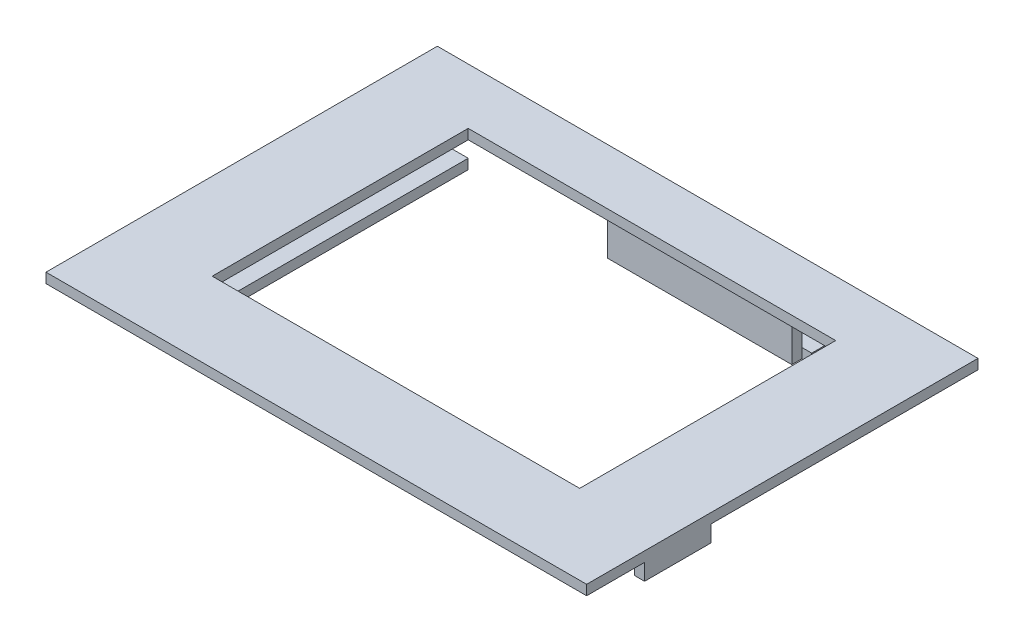
ISO-10303-21;
HEADER;
FILE_DESCRIPTION(('STEP AP214'),'2;1');
FILE_NAME('part.step','',(''),(''),'','','');
FILE_SCHEMA(('AUTOMOTIVE_DESIGN { 1 0 10303 214 1 1 1 1 }'));
ENDSEC;
DATA;
#1=APPLICATION_CONTEXT('core data for automotive mechanical design processes');
#2=APPLICATION_PROTOCOL_DEFINITION('international standard','automotive_design',2000,#1);
#3=PRODUCT_CONTEXT('',#1,'mechanical');
#4=PRODUCT('Part','Part','',(#3));
#5=PRODUCT_RELATED_PRODUCT_CATEGORY('part','',(#4));
#6=PRODUCT_DEFINITION_FORMATION('','',#4);
#7=PRODUCT_DEFINITION_CONTEXT('part definition',#1,'design');
#8=PRODUCT_DEFINITION('design','',#6,#7);
#9=PRODUCT_DEFINITION_SHAPE('','',#8);
#10=(LENGTH_UNIT() NAMED_UNIT(*) SI_UNIT(.MILLI.,.METRE.));
#11=(NAMED_UNIT(*) PLANE_ANGLE_UNIT() SI_UNIT($,.RADIAN.));
#12=(NAMED_UNIT(*) SI_UNIT($,.STERADIAN.) SOLID_ANGLE_UNIT());
#13=UNCERTAINTY_MEASURE_WITH_UNIT(LENGTH_MEASURE(1.E-05),#10,'distance_accuracy_value','');
#14=(GEOMETRIC_REPRESENTATION_CONTEXT(3) GLOBAL_UNCERTAINTY_ASSIGNED_CONTEXT((#13)) GLOBAL_UNIT_ASSIGNED_CONTEXT((#10,
#11,#12)) REPRESENTATION_CONTEXT('',''));
#15=CARTESIAN_POINT('',(0.,0.,0.));
#16=DIRECTION('',(0.,0.,1.));
#17=DIRECTION('',(1.,0.,0.));
#18=AXIS2_PLACEMENT_3D('',#15,#16,#17);
#19=CARTESIAN_POINT('',(-29.0968821292776,-2.6,0.));
#20=DIRECTION('',(1.,0.,0.));
#21=DIRECTION('',(0.,0.,-1.));
#22=AXIS2_PLACEMENT_3D('',#19,#20,#21);
#23=PLANE('',#22);
#24=DIRECTION('',(0.,1.,0.));
#25=VECTOR('',#24,1.);
#26=CARTESIAN_POINT('',(-29.0968821292776,-2.6,7.88902091254752));
#27=LINE('',#26,#25);
#28=CARTESIAN_POINT('',(-29.0968821292776,-1.6,7.88902091254752));
#29=VERTEX_POINT('',#28);
#30=CARTESIAN_POINT('',(-29.0968821292776,0.,7.88902091254752));
#31=VERTEX_POINT('',#30);
#32=EDGE_CURVE('E56',#29,#31,#27,.T.);
#33=ORIENTED_EDGE('',*,*,#32,.F.);
#34=DIRECTION('',(0.,0.,1.));
#35=VECTOR('',#34,1.);
#36=CARTESIAN_POINT('',(-29.0968821292776,-1.6,7.88902091254752));
#37=LINE('',#36,#35);
#38=CARTESIAN_POINT('',(-29.0968821292776,-1.6,-17.8409790874525));
#39=VERTEX_POINT('',#38);
#40=EDGE_CURVE('E51',#39,#29,#37,.T.);
#41=ORIENTED_EDGE('',*,*,#40,.F.);
#42=DIRECTION('',(0.,1.,0.));
#43=VECTOR('',#42,1.);
#44=CARTESIAN_POINT('',(-29.0968821292776,-2.6,-17.8409790874525));
#45=LINE('',#44,#43);
#46=CARTESIAN_POINT('',(-29.0968821292776,0.,-17.8409790874525));
#47=VERTEX_POINT('',#46);
#48=EDGE_CURVE('E317',#39,#47,#45,.T.);
#49=ORIENTED_EDGE('',*,*,#48,.T.);
#50=DIRECTION('',(0.,0.,-1.));
#51=VECTOR('',#50,1.);
#52=CARTESIAN_POINT('',(-29.0968821292776,0.,0.));
#53=LINE('',#52,#51);
#54=EDGE_CURVE('E311',#31,#47,#53,.T.);
#55=ORIENTED_EDGE('',*,*,#54,.F.);
#56=EDGE_LOOP('',(#33,#41,#49,#55));
#57=FACE_BOUND('',#56,.T.);
#58=ADVANCED_FACE('F33',(#57),#23,.T.);
#59=CARTESIAN_POINT('',(15.8331178707224,-2.6,0.));
#60=DIRECTION('',(1.,0.,0.));
#61=DIRECTION('',(0.,0.,-1.));
#62=AXIS2_PLACEMENT_3D('',#59,#60,#61);
#63=PLANE('',#62);
#64=DIRECTION('',(0.,0.,-1.));
#65=VECTOR('',#64,1.);
#66=CARTESIAN_POINT('',(15.8331178707224,-1.6,7.88902091254752));
#67=LINE('',#66,#65);
#68=CARTESIAN_POINT('',(15.8331178707224,-1.6,7.88902091254752));
#69=VERTEX_POINT('',#68);
#70=CARTESIAN_POINT('',(15.8331178707224,-1.6,-17.8409790874525));
#71=VERTEX_POINT('',#70);
#72=EDGE_CURVE('E285',#69,#71,#67,.T.);
#73=ORIENTED_EDGE('',*,*,#72,.F.);
#74=DIRECTION('',(0.,1.,0.));
#75=VECTOR('',#74,1.);
#76=CARTESIAN_POINT('',(15.8331178707224,-2.6,7.88902091254752));
#77=LINE('',#76,#75);
#78=CARTESIAN_POINT('',(15.8331178707224,0.,7.88902091254752));
#79=VERTEX_POINT('',#78);
#80=EDGE_CURVE('E345',#69,#79,#77,.T.);
#81=ORIENTED_EDGE('',*,*,#80,.T.);
#82=DIRECTION('',(0.,0.,-1.));
#83=VECTOR('',#82,1.);
#84=CARTESIAN_POINT('',(15.8331178707224,0.,0.));
#85=LINE('',#84,#83);
#86=CARTESIAN_POINT('',(15.8331178707224,0.,-17.8409790874525));
#87=VERTEX_POINT('',#86);
#88=EDGE_CURVE('E336',#79,#87,#85,.T.);
#89=ORIENTED_EDGE('',*,*,#88,.T.);
#90=DIRECTION('',(0.,1.,0.));
#91=VECTOR('',#90,1.);
#92=CARTESIAN_POINT('',(15.8331178707224,-2.6,-17.8409790874525));
#93=LINE('',#92,#91);
#94=EDGE_CURVE('E343',#71,#87,#93,.T.);
#95=ORIENTED_EDGE('',*,*,#94,.F.);
#96=EDGE_LOOP('',(#73,#81,#89,#95));
#97=FACE_BOUND('',#96,.T.);
#98=ADVANCED_FACE('F584',(#97),#63,.F.);
#99=CARTESIAN_POINT('',(-33.7968821292776,1.,-23.4409790874525));
#100=DIRECTION('',(0.,0.,1.));
#101=DIRECTION('',(1.,0.,0.));
#102=AXIS2_PLACEMENT_3D('',#99,#100,#101);
#103=PLANE('',#102);
#104=DIRECTION('',(1.,0.,0.));
#105=VECTOR('',#104,1.);
#106=CARTESIAN_POINT('',(3.82311787072243,-6.9,-23.4409790874525));
#107=LINE('',#106,#105);
#108=CARTESIAN_POINT('',(-15.6768821292776,-6.9,-23.4409790874525));
#109=VERTEX_POINT('',#108);
#110=CARTESIAN_POINT('',(2.82311787072243,-6.9,-23.4409790874525));
#111=VERTEX_POINT('',#110);
#112=EDGE_CURVE('E11',#109,#111,#107,.T.);
#113=ORIENTED_EDGE('',*,*,#112,.F.);
#114=DIRECTION('',(0.,1.,0.));
#115=VECTOR('',#114,1.);
#116=CARTESIAN_POINT('',(-15.6768821292776,0.,-23.4409790874525));
#117=LINE('',#116,#115);
#118=CARTESIAN_POINT('',(-15.6768821292776,0.,-23.4409790874525));
#119=VERTEX_POINT('',#118);
#120=EDGE_CURVE('E424',#109,#119,#117,.T.);
#121=ORIENTED_EDGE('',*,*,#120,.T.);
#122=DIRECTION('',(-1.,0.,0.));
#123=VECTOR('',#122,1.);
#124=CARTESIAN_POINT('',(-33.7968821292776,0.,-23.4409790874525));
#125=LINE('',#124,#123);
#126=CARTESIAN_POINT('',(-33.7968821292776,0.,-23.4409790874525));
#127=VERTEX_POINT('',#126);
#128=EDGE_CURVE('E482',#119,#127,#125,.T.);
#129=ORIENTED_EDGE('',*,*,#128,.T.);
#130=DIRECTION('',(0.,-1.,0.));
#131=VECTOR('',#130,1.);
#132=CARTESIAN_POINT('',(-33.7968821292776,1.,-23.4409790874525));
#133=LINE('',#132,#131);
#134=CARTESIAN_POINT('',(-33.7968821292776,1.,-23.4409790874525));
#135=VERTEX_POINT('',#134);
#136=EDGE_CURVE('E474',#135,#127,#133,.T.);
#137=ORIENTED_EDGE('',*,*,#136,.F.);
#138=DIRECTION('',(-1.,0.,0.));
#139=VECTOR('',#138,1.);
#140=CARTESIAN_POINT('',(-33.7968821292776,1.,-23.4409790874525));
#141=LINE('',#140,#139);
#142=CARTESIAN_POINT('',(20.5331178707224,1.,-23.4409790874525));
#143=VERTEX_POINT('',#142);
#144=EDGE_CURVE('E472',#143,#135,#141,.T.);
#145=ORIENTED_EDGE('',*,*,#144,.F.);
#146=DIRECTION('',(0.,-1.,0.));
#147=VECTOR('',#146,1.);
#148=CARTESIAN_POINT('',(20.5331178707224,1.,-23.4409790874525));
#149=LINE('',#148,#147);
#150=CARTESIAN_POINT('',(20.5331178707224,0.,-23.4409790874525));
#151=VERTEX_POINT('',#150);
#152=EDGE_CURVE('E486',#143,#151,#149,.T.);
#153=ORIENTED_EDGE('',*,*,#152,.T.);
#154=CARTESIAN_POINT('',(2.82311787072243,0.,-23.4409790874525));
#155=VERTEX_POINT('',#154);
#156=EDGE_CURVE('E468',#151,#155,#125,.T.);
#157=ORIENTED_EDGE('',*,*,#156,.T.);
#158=DIRECTION('',(0.,-1.,0.));
#159=VECTOR('',#158,1.);
#160=CARTESIAN_POINT('',(2.82311787072243,0.,-23.4409790874525));
#161=LINE('',#160,#159);
#162=EDGE_CURVE('E422',#155,#111,#161,.T.);
#163=ORIENTED_EDGE('',*,*,#162,.T.);
#164=EDGE_LOOP('',(#113,#121,#129,#137,#145,#153,#157,#163));
#165=FACE_BOUND('',#164,.T.);
#166=ADVANCED_FACE('F518',(#165),#103,.F.);
#167=CARTESIAN_POINT('',(0.,0.,0.));
#168=DIRECTION('',(0.,1.,0.));
#169=DIRECTION('',(0.,0.,1.));
#170=AXIS2_PLACEMENT_3D('',#167,#168,#169);
#171=PLANE('',#170);
#172=DIRECTION('',(-1.,0.,0.));
#173=VECTOR('',#172,1.);
#174=CARTESIAN_POINT('',(0.,0.,-17.8409790874525));
#175=LINE('',#174,#173);
#176=CARTESIAN_POINT('',(-31.0968821292776,0.,-17.8409790874525));
#177=VERTEX_POINT('',#176);
#178=EDGE_CURVE('E309',#47,#177,#175,.T.);
#179=ORIENTED_EDGE('',*,*,#178,.T.);
#180=DIRECTION('',(0.,0.,1.));
#181=VECTOR('',#180,1.);
#182=CARTESIAN_POINT('',(-31.0968821292776,0.,0.));
#183=LINE('',#182,#181);
#184=CARTESIAN_POINT('',(-31.0968821292776,0.,7.88902091254752));
#185=VERTEX_POINT('',#184);
#186=EDGE_CURVE('E303',#177,#185,#183,.T.);
#187=ORIENTED_EDGE('',*,*,#186,.T.);
#188=DIRECTION('',(-1.,0.,0.));
#189=VECTOR('',#188,1.);
#190=CARTESIAN_POINT('',(0.,0.,7.88902091254752));
#191=LINE('',#190,#189);
#192=EDGE_CURVE('E306',#31,#185,#191,.T.);
#193=ORIENTED_EDGE('',*,*,#192,.F.);
#194=ORIENTED_EDGE('',*,*,#54,.T.);
#195=EDGE_LOOP('',(#179,#187,#193,#194));
#196=FACE_BOUND('',#195,.T.);
#197=DIRECTION('',(1.,0.,0.));
#198=VECTOR('',#197,1.);
#199=CARTESIAN_POINT('',(0.,0.,7.88902091254752));
#200=LINE('',#199,#198);
#201=CARTESIAN_POINT('',(17.8331178707224,0.,7.88902091254752));
#202=VERTEX_POINT('',#201);
#203=EDGE_CURVE('E334',#79,#202,#200,.T.);
#204=ORIENTED_EDGE('',*,*,#203,.T.);
#205=DIRECTION('',(0.,0.,-1.));
#206=VECTOR('',#205,1.);
#207=CARTESIAN_POINT('',(17.8331178707224,0.,0.));
#208=LINE('',#207,#206);
#209=CARTESIAN_POINT('',(17.8331178707224,0.,-17.8409790874525));
#210=VERTEX_POINT('',#209);
#211=EDGE_CURVE('E322',#202,#210,#208,.T.);
#212=ORIENTED_EDGE('',*,*,#211,.T.);
#213=DIRECTION('',(1.,0.,0.));
#214=VECTOR('',#213,1.);
#215=CARTESIAN_POINT('',(0.,0.,-17.8409790874525));
#216=LINE('',#215,#214);
#217=EDGE_CURVE('E327',#87,#210,#216,.T.);
#218=ORIENTED_EDGE('',*,*,#217,.F.);
#219=ORIENTED_EDGE('',*,*,#88,.F.);
#220=EDGE_LOOP('',(#204,#212,#218,#219));
#221=FACE_BOUND('',#220,.T.);
#222=DIRECTION('',(0.,0.,1.));
#223=VECTOR('',#222,1.);
#224=CARTESIAN_POINT('',(-25.0968821292776,0.,-23.4409790874525));
#225=LINE('',#224,#223);
#226=CARTESIAN_POINT('',(-25.0968821292776,0.,-17.8409790874525));
#227=VERTEX_POINT('',#226);
#228=CARTESIAN_POINT('',(-25.0968821292776,0.,7.88902091254752));
#229=VERTEX_POINT('',#228);
#230=EDGE_CURVE('E380',#227,#229,#225,.T.);
#231=ORIENTED_EDGE('',*,*,#230,.T.);
#232=DIRECTION('',(-1.,0.,0.));
#233=VECTOR('',#232,1.);
#234=CARTESIAN_POINT('',(20.5331178707224,0.,7.88902091254752));
#235=LINE('',#234,#233);
#236=CARTESIAN_POINT('',(11.8331178707224,0.,7.88902091254752));
#237=VERTEX_POINT('',#236);
#238=EDGE_CURVE('E403',#237,#229,#235,.T.);
#239=ORIENTED_EDGE('',*,*,#238,.F.);
#240=DIRECTION('',(0.,0.,1.));
#241=VECTOR('',#240,1.);
#242=CARTESIAN_POINT('',(11.8331178707224,0.,-23.4409790874525));
#243=LINE('',#242,#241);
#244=CARTESIAN_POINT('',(11.8331178707224,0.,-17.8409790874525));
#245=VERTEX_POINT('',#244);
#246=EDGE_CURVE('E388',#245,#237,#243,.T.);
#247=ORIENTED_EDGE('',*,*,#246,.F.);
#248=DIRECTION('',(-1.,0.,0.));
#249=VECTOR('',#248,1.);
#250=CARTESIAN_POINT('',(20.5331178707224,0.,-17.8409790874525));
#251=LINE('',#250,#249);
#252=EDGE_CURVE('E396',#245,#227,#251,.T.);
#253=ORIENTED_EDGE('',*,*,#252,.T.);
#254=EDGE_LOOP('',(#231,#239,#247,#253));
#255=FACE_BOUND('',#254,.T.);
#256=DIRECTION('',(0.,0.,-1.));
#257=VECTOR('',#256,1.);
#258=CARTESIAN_POINT('',(20.5331178707224,0.,-23.4409790874525));
#259=LINE('',#258,#257);
#260=CARTESIAN_POINT('',(20.5331178707224,0.,15.8890209125475));
#261=VERTEX_POINT('',#260);
#262=CARTESIAN_POINT('',(20.5331178707224,0.,10.0690209125475));
#263=VERTEX_POINT('',#262);
#264=EDGE_CURVE('E479',#261,#263,#259,.T.);
#265=ORIENTED_EDGE('',*,*,#264,.F.);
#266=DIRECTION('',(1.,0.,0.));
#267=VECTOR('',#266,1.);
#268=CARTESIAN_POINT('',(-33.7968821292776,0.,15.8890209125475));
#269=LINE('',#268,#267);
#270=CARTESIAN_POINT('',(-33.7968821292776,0.,15.8890209125475));
#271=VERTEX_POINT('',#270);
#272=EDGE_CURVE('E476',#271,#261,#269,.T.);
#273=ORIENTED_EDGE('',*,*,#272,.F.);
#274=DIRECTION('',(0.,0.,1.));
#275=VECTOR('',#274,1.);
#276=CARTESIAN_POINT('',(-33.7968821292776,0.,-23.4409790874525));
#277=LINE('',#276,#275);
#278=EDGE_CURVE('E459',#127,#271,#277,.T.);
#279=ORIENTED_EDGE('',*,*,#278,.F.);
#280=ORIENTED_EDGE('',*,*,#128,.F.);
#281=DIRECTION('',(0.,0.,-1.));
#282=VECTOR('',#281,1.);
#283=CARTESIAN_POINT('',(-15.6768821292776,0.,-22.4409790874525));
#284=LINE('',#283,#282);
#285=CARTESIAN_POINT('',(-15.6768821292776,0.,-22.4409790874525));
#286=VERTEX_POINT('',#285);
#287=EDGE_CURVE('E431',#286,#119,#284,.T.);
#288=ORIENTED_EDGE('',*,*,#287,.F.);
#289=DIRECTION('',(1.,0.,0.));
#290=VECTOR('',#289,1.);
#291=CARTESIAN_POINT('',(2.82311787072243,0.,-22.4409790874525));
#292=LINE('',#291,#290);
#293=CARTESIAN_POINT('',(2.82311787072243,0.,-22.4409790874525));
#294=VERTEX_POINT('',#293);
#295=EDGE_CURVE('E418',#286,#294,#292,.T.);
#296=ORIENTED_EDGE('',*,*,#295,.T.);
#297=DIRECTION('',(0.,0.,-1.));
#298=VECTOR('',#297,1.);
#299=CARTESIAN_POINT('',(2.82311787072243,0.,-22.4409790874525));
#300=LINE('',#299,#298);
#301=EDGE_CURVE('E427',#294,#155,#300,.T.);
#302=ORIENTED_EDGE('',*,*,#301,.T.);
#303=ORIENTED_EDGE('',*,*,#156,.F.);
#304=CARTESIAN_POINT('',(20.5331178707224,0.,3.36902091254752));
#305=VERTEX_POINT('',#304);
#306=EDGE_CURVE('E478',#305,#151,#259,.T.);
#307=ORIENTED_EDGE('',*,*,#306,.F.);
#308=DIRECTION('',(1.,0.,0.));
#309=VECTOR('',#308,1.);
#310=CARTESIAN_POINT('',(19.5331178707224,0.,3.36902091254752));
#311=LINE('',#310,#309);
#312=CARTESIAN_POINT('',(19.5331178707224,0.,3.36902091254752));
#313=VERTEX_POINT('',#312);
#314=EDGE_CURVE('E460',#313,#305,#311,.T.);
#315=ORIENTED_EDGE('',*,*,#314,.F.);
#316=DIRECTION('',(0.,0.,1.));
#317=VECTOR('',#316,1.);
#318=CARTESIAN_POINT('',(19.5331178707224,0.,10.0690209125475));
#319=LINE('',#318,#317);
#320=CARTESIAN_POINT('',(19.5331178707224,0.,10.0690209125475));
#321=VERTEX_POINT('',#320);
#322=EDGE_CURVE('E446',#313,#321,#319,.T.);
#323=ORIENTED_EDGE('',*,*,#322,.T.);
#324=DIRECTION('',(1.,0.,0.));
#325=VECTOR('',#324,1.);
#326=CARTESIAN_POINT('',(19.5331178707224,0.,10.0690209125475));
#327=LINE('',#326,#325);
#328=EDGE_CURVE('E456',#321,#263,#327,.T.);
#329=ORIENTED_EDGE('',*,*,#328,.T.);
#330=EDGE_LOOP('',(#265,#273,#279,#280,#288,#296,#302,#303,#307,#315,#323,#329));
#331=FACE_BOUND('',#330,.T.);
#332=ADVANCED_FACE('F515',(#196,#221,#255,#331),#171,.F.);
#333=CARTESIAN_POINT('',(-33.7968821292776,1.,-23.4409790874525));
#334=DIRECTION('',(1.,0.,0.));
#335=DIRECTION('',(0.,0.,-1.));
#336=AXIS2_PLACEMENT_3D('',#333,#334,#335);
#337=PLANE('',#336);
#338=DIRECTION('',(0.,-1.,0.));
#339=VECTOR('',#338,1.);
#340=CARTESIAN_POINT('',(-33.7968821292776,1.,15.8890209125475));
#341=LINE('',#340,#339);
#342=CARTESIAN_POINT('',(-33.7968821292776,1.,15.8890209125475));
#343=VERTEX_POINT('',#342);
#344=EDGE_CURVE('E492',#343,#271,#341,.T.);
#345=ORIENTED_EDGE('',*,*,#344,.F.);
#346=DIRECTION('',(0.,0.,1.));
#347=VECTOR('',#346,1.);
#348=CARTESIAN_POINT('',(-33.7968821292776,1.,-23.4409790874525));
#349=LINE('',#348,#347);
#350=EDGE_CURVE('E465',#135,#343,#349,.T.);
#351=ORIENTED_EDGE('',*,*,#350,.F.);
#352=ORIENTED_EDGE('',*,*,#136,.T.);
#353=ORIENTED_EDGE('',*,*,#278,.T.);
#354=EDGE_LOOP('',(#345,#351,#352,#353));
#355=FACE_BOUND('',#354,.T.);
#356=ADVANCED_FACE('F35',(#355),#337,.F.);
#357=CARTESIAN_POINT('',(-33.7968821292776,1.,15.8890209125475));
#358=DIRECTION('',(0.,0.,-1.));
#359=DIRECTION('',(-1.,0.,0.));
#360=AXIS2_PLACEMENT_3D('',#357,#358,#359);
#361=PLANE('',#360);
#362=DIRECTION('',(0.,-1.,0.));
#363=VECTOR('',#362,1.);
#364=CARTESIAN_POINT('',(20.5331178707224,1.,15.8890209125475));
#365=LINE('',#364,#363);
#366=CARTESIAN_POINT('',(20.5331178707224,1.,15.8890209125475));
#367=VERTEX_POINT('',#366);
#368=EDGE_CURVE('E489',#367,#261,#365,.T.);
#369=ORIENTED_EDGE('',*,*,#368,.F.);
#370=DIRECTION('',(1.,0.,0.));
#371=VECTOR('',#370,1.);
#372=CARTESIAN_POINT('',(-33.7968821292776,1.,15.8890209125475));
#373=LINE('',#372,#371);
#374=EDGE_CURVE('E467',#343,#367,#373,.T.);
#375=ORIENTED_EDGE('',*,*,#374,.F.);
#376=ORIENTED_EDGE('',*,*,#344,.T.);
#377=ORIENTED_EDGE('',*,*,#272,.T.);
#378=EDGE_LOOP('',(#369,#375,#376,#377));
#379=FACE_BOUND('',#378,.T.);
#380=ADVANCED_FACE('F532',(#379),#361,.F.);
#381=CARTESIAN_POINT('',(20.5331178707224,1.,-23.4409790874525));
#382=DIRECTION('',(-1.,0.,0.));
#383=DIRECTION('',(0.,0.,1.));
#384=AXIS2_PLACEMENT_3D('',#381,#382,#383);
#385=PLANE('',#384);
#386=DIRECTION('',(0.,1.,0.));
#387=VECTOR('',#386,1.);
#388=CARTESIAN_POINT('',(20.5331178707224,0.,3.36902091254752));
#389=LINE('',#388,#387);
#390=CARTESIAN_POINT('',(20.5331178707224,-1.65,3.36902091254752));
#391=VERTEX_POINT('',#390);
#392=EDGE_CURVE('E441',#391,#305,#389,.T.);
#393=ORIENTED_EDGE('',*,*,#392,.T.);
#394=ORIENTED_EDGE('',*,*,#306,.T.);
#395=ORIENTED_EDGE('',*,*,#152,.F.);
#396=DIRECTION('',(0.,0.,-1.));
#397=VECTOR('',#396,1.);
#398=CARTESIAN_POINT('',(20.5331178707224,1.,-23.4409790874525));
#399=LINE('',#398,#397);
#400=EDGE_CURVE('E470',#367,#143,#399,.T.);
#401=ORIENTED_EDGE('',*,*,#400,.F.);
#402=ORIENTED_EDGE('',*,*,#368,.T.);
#403=ORIENTED_EDGE('',*,*,#264,.T.);
#404=DIRECTION('',(0.,-1.,0.));
#405=VECTOR('',#404,1.);
#406=CARTESIAN_POINT('',(20.5331178707224,0.,10.0690209125475));
#407=LINE('',#406,#405);
#408=CARTESIAN_POINT('',(20.5331178707224,-1.65,10.0690209125475));
#409=VERTEX_POINT('',#408);
#410=EDGE_CURVE('E430',#263,#409,#407,.T.);
#411=ORIENTED_EDGE('',*,*,#410,.T.);
#412=DIRECTION('',(0.,0.,-1.));
#413=VECTOR('',#412,1.);
#414=CARTESIAN_POINT('',(20.5331178707224,-1.65,10.0690209125475));
#415=LINE('',#414,#413);
#416=EDGE_CURVE('E451',#409,#391,#415,.T.);
#417=ORIENTED_EDGE('',*,*,#416,.T.);
#418=EDGE_LOOP('',(#393,#394,#395,#401,#402,#403,#411,#417));
#419=FACE_BOUND('',#418,.T.);
#420=ADVANCED_FACE('F526',(#419),#385,.F.);
#421=CARTESIAN_POINT('',(0.,1.,0.));
#422=DIRECTION('',(0.,1.,0.));
#423=DIRECTION('',(0.,0.,1.));
#424=AXIS2_PLACEMENT_3D('',#421,#422,#423);
#425=PLANE('',#424);
#426=DIRECTION('',(-1.,0.,0.));
#427=VECTOR('',#426,1.);
#428=CARTESIAN_POINT('',(20.5331178707224,1.,7.88902091254752));
#429=LINE('',#428,#427);
#430=CARTESIAN_POINT('',(11.8331178707224,1.,7.88902091254752));
#431=VERTEX_POINT('',#430);
#432=CARTESIAN_POINT('',(-25.0968821292776,1.,7.88902091254752));
#433=VERTEX_POINT('',#432);
#434=EDGE_CURVE('E400',#431,#433,#429,.T.);
#435=ORIENTED_EDGE('',*,*,#434,.T.);
#436=DIRECTION('',(0.,0.,1.));
#437=VECTOR('',#436,1.);
#438=CARTESIAN_POINT('',(-25.0968821292776,1.,-23.4409790874525));
#439=LINE('',#438,#437);
#440=CARTESIAN_POINT('',(-25.0968821292776,1.,-17.8409790874525));
#441=VERTEX_POINT('',#440);
#442=EDGE_CURVE('E381',#441,#433,#439,.T.);
#443=ORIENTED_EDGE('',*,*,#442,.F.);
#444=DIRECTION('',(-1.,0.,0.));
#445=VECTOR('',#444,1.);
#446=CARTESIAN_POINT('',(20.5331178707224,1.,-17.8409790874525));
#447=LINE('',#446,#445);
#448=CARTESIAN_POINT('',(11.8331178707224,1.,-17.8409790874525));
#449=VERTEX_POINT('',#448);
#450=EDGE_CURVE('E397',#449,#441,#447,.T.);
#451=ORIENTED_EDGE('',*,*,#450,.F.);
#452=DIRECTION('',(0.,0.,1.));
#453=VECTOR('',#452,1.);
#454=CARTESIAN_POINT('',(11.8331178707224,1.,-23.4409790874525));
#455=LINE('',#454,#453);
#456=EDGE_CURVE('E387',#449,#431,#455,.T.);
#457=ORIENTED_EDGE('',*,*,#456,.T.);
#458=EDGE_LOOP('',(#435,#443,#451,#457));
#459=FACE_BOUND('',#458,.T.);
#460=ORIENTED_EDGE('',*,*,#374,.T.);
#461=ORIENTED_EDGE('',*,*,#400,.T.);
#462=ORIENTED_EDGE('',*,*,#144,.T.);
#463=ORIENTED_EDGE('',*,*,#350,.T.);
#464=EDGE_LOOP('',(#460,#461,#462,#463));
#465=FACE_BOUND('',#464,.T.);
#466=ADVANCED_FACE('F507',(#459,#465),#425,.T.);
#467=CARTESIAN_POINT('',(19.5331178707224,0.,10.0690209125475));
#468=DIRECTION('',(0.,0.,1.));
#469=DIRECTION('',(1.,0.,0.));
#470=AXIS2_PLACEMENT_3D('',#467,#468,#469);
#471=PLANE('',#470);
#472=ORIENTED_EDGE('',*,*,#410,.F.);
#473=ORIENTED_EDGE('',*,*,#328,.F.);
#474=DIRECTION('',(0.,-1.,0.));
#475=VECTOR('',#474,1.);
#476=CARTESIAN_POINT('',(19.5331178707224,0.,10.0690209125475));
#477=LINE('',#476,#475);
#478=CARTESIAN_POINT('',(19.5331178707224,-1.65,10.0690209125475));
#479=VERTEX_POINT('',#478);
#480=EDGE_CURVE('E437',#321,#479,#477,.T.);
#481=ORIENTED_EDGE('',*,*,#480,.T.);
#482=DIRECTION('',(1.,0.,0.));
#483=VECTOR('',#482,1.);
#484=CARTESIAN_POINT('',(19.5331178707224,-1.65,10.0690209125475));
#485=LINE('',#484,#483);
#486=EDGE_CURVE('E448',#479,#409,#485,.T.);
#487=ORIENTED_EDGE('',*,*,#486,.T.);
#488=EDGE_LOOP('',(#472,#473,#481,#487));
#489=FACE_BOUND('',#488,.T.);
#490=ADVANCED_FACE('F570',(#489),#471,.T.);
#491=CARTESIAN_POINT('',(19.5331178707224,0.,3.36902091254752));
#492=DIRECTION('',(0.,0.,-1.));
#493=DIRECTION('',(-1.,0.,0.));
#494=AXIS2_PLACEMENT_3D('',#491,#492,#493);
#495=PLANE('',#494);
#496=ORIENTED_EDGE('',*,*,#392,.F.);
#497=DIRECTION('',(1.,0.,0.));
#498=VECTOR('',#497,1.);
#499=CARTESIAN_POINT('',(19.5331178707224,-1.65,3.36902091254752));
#500=LINE('',#499,#498);
#501=CARTESIAN_POINT('',(19.5331178707224,-1.65,3.36902091254752));
#502=VERTEX_POINT('',#501);
#503=EDGE_CURVE('E462',#502,#391,#500,.T.);
#504=ORIENTED_EDGE('',*,*,#503,.F.);
#505=DIRECTION('',(0.,1.,0.));
#506=VECTOR('',#505,1.);
#507=CARTESIAN_POINT('',(19.5331178707224,0.,3.36902091254752));
#508=LINE('',#507,#506);
#509=EDGE_CURVE('E444',#502,#313,#508,.T.);
#510=ORIENTED_EDGE('',*,*,#509,.T.);
#511=ORIENTED_EDGE('',*,*,#314,.T.);
#512=EDGE_LOOP('',(#496,#504,#510,#511));
#513=FACE_BOUND('',#512,.T.);
#514=ADVANCED_FACE('F563',(#513),#495,.T.);
#515=CARTESIAN_POINT('',(19.5331178707224,-1.65,10.0690209125475));
#516=DIRECTION('',(0.,-1.,0.));
#517=DIRECTION('',(0.,0.,-1.));
#518=AXIS2_PLACEMENT_3D('',#515,#516,#517);
#519=PLANE('',#518);
#520=ORIENTED_EDGE('',*,*,#416,.F.);
#521=ORIENTED_EDGE('',*,*,#486,.F.);
#522=DIRECTION('',(0.,0.,-1.));
#523=VECTOR('',#522,1.);
#524=CARTESIAN_POINT('',(19.5331178707224,-1.65,10.0690209125475));
#525=LINE('',#524,#523);
#526=EDGE_CURVE('E440',#479,#502,#525,.T.);
#527=ORIENTED_EDGE('',*,*,#526,.T.);
#528=ORIENTED_EDGE('',*,*,#503,.T.);
#529=EDGE_LOOP('',(#520,#521,#527,#528));
#530=FACE_BOUND('',#529,.T.);
#531=ADVANCED_FACE('F573',(#530),#519,.T.);
#532=CARTESIAN_POINT('',(19.5331178707224,0.,0.));
#533=DIRECTION('',(1.,0.,0.));
#534=DIRECTION('',(0.,0.,-1.));
#535=AXIS2_PLACEMENT_3D('',#532,#533,#534);
#536=PLANE('',#535);
#537=ORIENTED_EDGE('',*,*,#480,.F.);
#538=ORIENTED_EDGE('',*,*,#322,.F.);
#539=ORIENTED_EDGE('',*,*,#509,.F.);
#540=ORIENTED_EDGE('',*,*,#526,.F.);
#541=EDGE_LOOP('',(#537,#538,#539,#540));
#542=FACE_BOUND('',#541,.T.);
#543=ADVANCED_FACE('F568',(#542),#536,.F.);
#544=CARTESIAN_POINT('',(2.82311787072243,0.,-22.4409790874525));
#545=DIRECTION('',(1.,0.,0.));
#546=DIRECTION('',(0.,1.,0.));
#547=AXIS2_PLACEMENT_3D('',#544,#545,#546);
#548=PLANE('',#547);
#549=ORIENTED_EDGE('',*,*,#162,.F.);
#550=ORIENTED_EDGE('',*,*,#301,.F.);
#551=DIRECTION('',(0.,-1.,0.));
#552=VECTOR('',#551,1.);
#553=CARTESIAN_POINT('',(2.82311787072243,0.,-22.4409790874525));
#554=LINE('',#553,#552);
#555=CARTESIAN_POINT('',(2.82311787072243,-7.9,-22.4409790874525));
#556=VERTEX_POINT('',#555);
#557=EDGE_CURVE('E409',#294,#556,#554,.T.);
#558=ORIENTED_EDGE('',*,*,#557,.T.);
#559=DIRECTION('',(0.,0.,-1.));
#560=VECTOR('',#559,1.);
#561=CARTESIAN_POINT('',(2.82311787072243,-7.9,-22.4409790874525));
#562=LINE('',#561,#560);
#563=CARTESIAN_POINT('',(2.82311787072243,-7.9,-23.4409790874525));
#564=VERTEX_POINT('',#563);
#565=EDGE_CURVE('E421',#556,#564,#562,.T.);
#566=ORIENTED_EDGE('',*,*,#565,.T.);
#567=EDGE_CURVE('E406',#111,#564,#161,.T.);
#568=ORIENTED_EDGE('',*,*,#567,.F.);
#569=EDGE_LOOP('',(#549,#550,#558,#566,#568));
#570=FACE_BOUND('',#569,.T.);
#571=ADVANCED_FACE('F555',(#570),#548,.T.);
#572=CARTESIAN_POINT('',(-15.6768821292776,0.,-22.4409790874525));
#573=DIRECTION('',(-1.,0.,0.));
#574=DIRECTION('',(0.,-1.,0.));
#575=AXIS2_PLACEMENT_3D('',#572,#573,#574);
#576=PLANE('',#575);
#577=CARTESIAN_POINT('',(-15.6768821292776,-7.9,-23.4409790874525));
#578=VERTEX_POINT('',#577);
#579=EDGE_CURVE('E413',#578,#109,#117,.T.);
#580=ORIENTED_EDGE('',*,*,#579,.F.);
#581=DIRECTION('',(0.,0.,-1.));
#582=VECTOR('',#581,1.);
#583=CARTESIAN_POINT('',(-15.6768821292776,-7.9,-22.4409790874525));
#584=LINE('',#583,#582);
#585=CARTESIAN_POINT('',(-15.6768821292776,-7.9,-22.4409790874525));
#586=VERTEX_POINT('',#585);
#587=EDGE_CURVE('E434',#586,#578,#584,.T.);
#588=ORIENTED_EDGE('',*,*,#587,.F.);
#589=DIRECTION('',(0.,1.,0.));
#590=VECTOR('',#589,1.);
#591=CARTESIAN_POINT('',(-15.6768821292776,0.,-22.4409790874525));
#592=LINE('',#591,#590);
#593=EDGE_CURVE('E416',#586,#286,#592,.T.);
#594=ORIENTED_EDGE('',*,*,#593,.T.);
#595=ORIENTED_EDGE('',*,*,#287,.T.);
#596=ORIENTED_EDGE('',*,*,#120,.F.);
#597=EDGE_LOOP('',(#580,#588,#594,#595,#596));
#598=FACE_BOUND('',#597,.T.);
#599=ADVANCED_FACE('F544',(#598),#576,.T.);
#600=CARTESIAN_POINT('',(2.82311787072243,-7.9,-22.4409790874525));
#601=DIRECTION('',(0.,-1.,0.));
#602=DIRECTION('',(0.,0.,-1.));
#603=AXIS2_PLACEMENT_3D('',#600,#601,#602);
#604=PLANE('',#603);
#605=ORIENTED_EDGE('',*,*,#587,.T.);
#606=DIRECTION('',(-1.,0.,0.));
#607=VECTOR('',#606,1.);
#608=CARTESIAN_POINT('',(3.82311787072243,-7.9,-23.4409790874525));
#609=LINE('',#608,#607);
#610=CARTESIAN_POINT('',(-16.6768821292776,-7.9,-23.4409790874525));
#611=VERTEX_POINT('',#610);
#612=EDGE_CURVE('E350',#578,#611,#609,.T.);
#613=ORIENTED_EDGE('',*,*,#612,.T.);
#614=DIRECTION('',(0.,0.,1.));
#615=VECTOR('',#614,1.);
#616=CARTESIAN_POINT('',(-16.6768821292776,-7.9,-29.6909790874525));
#617=LINE('',#616,#615);
#618=CARTESIAN_POINT('',(-16.6768821292776,-7.9,-29.6909790874525));
#619=VERTEX_POINT('',#618);
#620=EDGE_CURVE('E377',#619,#611,#617,.T.);
#621=ORIENTED_EDGE('',*,*,#620,.F.);
#622=DIRECTION('',(-1.,0.,0.));
#623=VECTOR('',#622,1.);
#624=CARTESIAN_POINT('',(3.82311787072243,-7.9,-29.6909790874525));
#625=LINE('',#624,#623);
#626=CARTESIAN_POINT('',(3.82311787072243,-7.9,-29.6909790874525));
#627=VERTEX_POINT('',#626);
#628=EDGE_CURVE('E351',#627,#619,#625,.T.);
#629=ORIENTED_EDGE('',*,*,#628,.F.);
#630=DIRECTION('',(0.,0.,1.));
#631=VECTOR('',#630,1.);
#632=CARTESIAN_POINT('',(3.82311787072243,-7.9,-29.6909790874525));
#633=LINE('',#632,#631);
#634=CARTESIAN_POINT('',(3.82311787072243,-7.9,-23.4409790874525));
#635=VERTEX_POINT('',#634);
#636=EDGE_CURVE('E361',#627,#635,#633,.T.);
#637=ORIENTED_EDGE('',*,*,#636,.T.);
#638=EDGE_CURVE('E362',#635,#564,#609,.T.);
#639=ORIENTED_EDGE('',*,*,#638,.T.);
#640=ORIENTED_EDGE('',*,*,#565,.F.);
#641=DIRECTION('',(-1.,0.,0.));
#642=VECTOR('',#641,1.);
#643=CARTESIAN_POINT('',(2.82311787072243,-7.9,-22.4409790874525));
#644=LINE('',#643,#642);
#645=EDGE_CURVE('E412',#556,#586,#644,.T.);
#646=ORIENTED_EDGE('',*,*,#645,.T.);
#647=EDGE_LOOP('',(#605,#613,#621,#629,#637,#639,#640,#646));
#648=FACE_BOUND('',#647,.T.);
#649=ADVANCED_FACE('F650',(#648),#604,.T.);
#650=CARTESIAN_POINT('',(0.,0.,-22.4409790874525));
#651=DIRECTION('',(0.,0.,-1.));
#652=DIRECTION('',(-1.,0.,0.));
#653=AXIS2_PLACEMENT_3D('',#650,#651,#652);
#654=PLANE('',#653);
#655=ORIENTED_EDGE('',*,*,#557,.F.);
#656=ORIENTED_EDGE('',*,*,#295,.F.);
#657=ORIENTED_EDGE('',*,*,#593,.F.);
#658=ORIENTED_EDGE('',*,*,#645,.F.);
#659=EDGE_LOOP('',(#655,#656,#657,#658));
#660=FACE_BOUND('',#659,.T.);
#661=ADVANCED_FACE('F550',(#660),#654,.F.);
#662=CARTESIAN_POINT('',(20.5331178707224,0.,7.88902091254752));
#663=DIRECTION('',(0.,0.,-1.));
#664=DIRECTION('',(-1.,0.,0.));
#665=AXIS2_PLACEMENT_3D('',#662,#663,#664);
#666=PLANE('',#665);
#667=DIRECTION('',(0.,-1.,0.));
#668=VECTOR('',#667,1.);
#669=CARTESIAN_POINT('',(-25.0968821292776,0.,7.88902091254752));
#670=LINE('',#669,#668);
#671=EDGE_CURVE('E383',#433,#229,#670,.T.);
#672=ORIENTED_EDGE('',*,*,#671,.F.);
#673=ORIENTED_EDGE('',*,*,#434,.F.);
#674=DIRECTION('',(0.,1.,0.));
#675=VECTOR('',#674,1.);
#676=CARTESIAN_POINT('',(11.8331178707224,0.,7.88902091254752));
#677=LINE('',#676,#675);
#678=EDGE_CURVE('E391',#237,#431,#677,.T.);
#679=ORIENTED_EDGE('',*,*,#678,.F.);
#680=ORIENTED_EDGE('',*,*,#238,.T.);
#681=EDGE_LOOP('',(#672,#673,#679,#680));
#682=FACE_BOUND('',#681,.T.);
#683=ADVANCED_FACE('F513',(#682),#666,.T.);
#684=CARTESIAN_POINT('',(20.5331178707224,1.,-17.8409790874525));
#685=DIRECTION('',(0.,0.,1.));
#686=DIRECTION('',(1.,0.,0.));
#687=AXIS2_PLACEMENT_3D('',#684,#685,#686);
#688=PLANE('',#687);
#689=DIRECTION('',(0.,1.,0.));
#690=VECTOR('',#689,1.);
#691=CARTESIAN_POINT('',(-25.0968821292776,1.,-17.8409790874525));
#692=LINE('',#691,#690);
#693=EDGE_CURVE('E37',#227,#441,#692,.T.);
#694=ORIENTED_EDGE('',*,*,#693,.F.);
#695=ORIENTED_EDGE('',*,*,#252,.F.);
#696=DIRECTION('',(0.,-1.,0.));
#697=VECTOR('',#696,1.);
#698=CARTESIAN_POINT('',(11.8331178707224,1.,-17.8409790874525));
#699=LINE('',#698,#697);
#700=EDGE_CURVE('E494',#449,#245,#699,.T.);
#701=ORIENTED_EDGE('',*,*,#700,.F.);
#702=ORIENTED_EDGE('',*,*,#450,.T.);
#703=EDGE_LOOP('',(#694,#695,#701,#702));
#704=FACE_BOUND('',#703,.T.);
#705=ADVANCED_FACE('F509',(#704),#688,.T.);
#706=CARTESIAN_POINT('',(11.8331178707224,0.,-23.4409790874525));
#707=DIRECTION('',(-1.,0.,0.));
#708=DIRECTION('',(0.,0.,1.));
#709=AXIS2_PLACEMENT_3D('',#706,#707,#708);
#710=PLANE('',#709);
#711=ORIENTED_EDGE('',*,*,#246,.T.);
#712=ORIENTED_EDGE('',*,*,#678,.T.);
#713=ORIENTED_EDGE('',*,*,#456,.F.);
#714=ORIENTED_EDGE('',*,*,#700,.T.);
#715=EDGE_LOOP('',(#711,#712,#713,#714));
#716=FACE_BOUND('',#715,.T.);
#717=ADVANCED_FACE('F510',(#716),#710,.T.);
#718=CARTESIAN_POINT('',(-25.0968821292776,1.,-23.4409790874525));
#719=DIRECTION('',(1.,0.,0.));
#720=DIRECTION('',(0.,0.,-1.));
#721=AXIS2_PLACEMENT_3D('',#718,#719,#720);
#722=PLANE('',#721);
#723=ORIENTED_EDGE('',*,*,#442,.T.);
#724=ORIENTED_EDGE('',*,*,#671,.T.);
#725=ORIENTED_EDGE('',*,*,#230,.F.);
#726=ORIENTED_EDGE('',*,*,#693,.T.);
#727=EDGE_LOOP('',(#723,#724,#725,#726));
#728=FACE_BOUND('',#727,.T.);
#729=ADVANCED_FACE('F503',(#728),#722,.T.);
#730=CARTESIAN_POINT('',(0.,0.,-23.4409790874525));
#731=DIRECTION('',(0.,0.,1.));
#732=DIRECTION('',(1.,0.,0.));
#733=AXIS2_PLACEMENT_3D('',#730,#731,#732);
#734=PLANE('',#733);
#735=CARTESIAN_POINT('',(3.82311787072243,-6.9,-23.4409790874525));
#736=VERTEX_POINT('',#735);
#737=EDGE_CURVE('E44',#111,#736,#107,.T.);
#738=ORIENTED_EDGE('',*,*,#737,.F.);
#739=ORIENTED_EDGE('',*,*,#567,.T.);
#740=ORIENTED_EDGE('',*,*,#638,.F.);
#741=DIRECTION('',(0.,-1.,0.));
#742=VECTOR('',#741,1.);
#743=CARTESIAN_POINT('',(3.82311787072243,-6.9,-23.4409790874525));
#744=LINE('',#743,#742);
#745=EDGE_CURVE('E355',#736,#635,#744,.T.);
#746=ORIENTED_EDGE('',*,*,#745,.F.);
#747=EDGE_LOOP('',(#738,#739,#740,#746));
#748=FACE_BOUND('',#747,.T.);
#749=ADVANCED_FACE('F628',(#748),#734,.T.);
#750=CARTESIAN_POINT('',(-16.6768821292776,-6.9,-29.6909790874525));
#751=DIRECTION('',(1.,0.,0.));
#752=DIRECTION('',(0.,0.,-1.));
#753=AXIS2_PLACEMENT_3D('',#750,#751,#752);
#754=PLANE('',#753);
#755=DIRECTION('',(0.,1.,0.));
#756=VECTOR('',#755,1.);
#757=CARTESIAN_POINT('',(-16.6768821292776,-6.9,-23.4409790874525));
#758=LINE('',#757,#756);
#759=CARTESIAN_POINT('',(-16.6768821292776,-6.9,-23.4409790874525));
#760=VERTEX_POINT('',#759);
#761=EDGE_CURVE('E365',#611,#760,#758,.T.);
#762=ORIENTED_EDGE('',*,*,#761,.T.);
#763=DIRECTION('',(0.,0.,1.));
#764=VECTOR('',#763,1.);
#765=CARTESIAN_POINT('',(-16.6768821292776,-6.9,-29.6909790874525));
#766=LINE('',#765,#764);
#767=CARTESIAN_POINT('',(-16.6768821292776,-6.9,-29.6909790874525));
#768=VERTEX_POINT('',#767);
#769=EDGE_CURVE('E374',#768,#760,#766,.T.);
#770=ORIENTED_EDGE('',*,*,#769,.F.);
#771=DIRECTION('',(0.,1.,0.));
#772=VECTOR('',#771,1.);
#773=CARTESIAN_POINT('',(-16.6768821292776,-6.9,-29.6909790874525));
#774=LINE('',#773,#772);
#775=EDGE_CURVE('E354',#619,#768,#774,.T.);
#776=ORIENTED_EDGE('',*,*,#775,.F.);
#777=ORIENTED_EDGE('',*,*,#620,.T.);
#778=EDGE_LOOP('',(#762,#770,#776,#777));
#779=FACE_BOUND('',#778,.T.);
#780=ADVANCED_FACE('F635',(#779),#754,.F.);
#781=CARTESIAN_POINT('',(3.82311787072243,-6.9,-29.6909790874525));
#782=DIRECTION('',(0.,-1.,0.));
#783=DIRECTION('',(0.,0.,-1.));
#784=AXIS2_PLACEMENT_3D('',#781,#782,#783);
#785=PLANE('',#784);
#786=EDGE_CURVE('E43',#760,#109,#107,.T.);
#787=ORIENTED_EDGE('',*,*,#786,.T.);
#788=ORIENTED_EDGE('',*,*,#112,.T.);
#789=ORIENTED_EDGE('',*,*,#737,.T.);
#790=DIRECTION('',(0.,0.,1.));
#791=VECTOR('',#790,1.);
#792=CARTESIAN_POINT('',(3.82311787072243,-6.9,-29.6909790874525));
#793=LINE('',#792,#791);
#794=CARTESIAN_POINT('',(3.82311787072243,-6.9,-29.6909790874525));
#795=VERTEX_POINT('',#794);
#796=EDGE_CURVE('E371',#795,#736,#793,.T.);
#797=ORIENTED_EDGE('',*,*,#796,.F.);
#798=DIRECTION('',(1.,0.,0.));
#799=VECTOR('',#798,1.);
#800=CARTESIAN_POINT('',(3.82311787072243,-6.9,-29.6909790874525));
#801=LINE('',#800,#799);
#802=EDGE_CURVE('E357',#768,#795,#801,.T.);
#803=ORIENTED_EDGE('',*,*,#802,.F.);
#804=ORIENTED_EDGE('',*,*,#769,.T.);
#805=EDGE_LOOP('',(#787,#788,#789,#797,#803,#804));
#806=FACE_BOUND('',#805,.T.);
#807=ADVANCED_FACE('F631',(#806),#785,.F.);
#808=CARTESIAN_POINT('',(3.82311787072243,-6.9,-29.6909790874525));
#809=DIRECTION('',(-1.,0.,0.));
#810=DIRECTION('',(0.,0.,1.));
#811=AXIS2_PLACEMENT_3D('',#808,#809,#810);
#812=PLANE('',#811);
#813=ORIENTED_EDGE('',*,*,#745,.T.);
#814=ORIENTED_EDGE('',*,*,#636,.F.);
#815=DIRECTION('',(0.,-1.,0.));
#816=VECTOR('',#815,1.);
#817=CARTESIAN_POINT('',(3.82311787072243,-6.9,-29.6909790874525));
#818=LINE('',#817,#816);
#819=EDGE_CURVE('E359',#795,#627,#818,.T.);
#820=ORIENTED_EDGE('',*,*,#819,.F.);
#821=ORIENTED_EDGE('',*,*,#796,.T.);
#822=EDGE_LOOP('',(#813,#814,#820,#821));
#823=FACE_BOUND('',#822,.T.);
#824=ADVANCED_FACE('F623',(#823),#812,.F.);
#825=CARTESIAN_POINT('',(0.,0.,-29.6909790874525));
#826=DIRECTION('',(0.,0.,1.));
#827=DIRECTION('',(1.,0.,0.));
#828=AXIS2_PLACEMENT_3D('',#825,#826,#827);
#829=PLANE('',#828);
#830=ORIENTED_EDGE('',*,*,#628,.T.);
#831=ORIENTED_EDGE('',*,*,#775,.T.);
#832=ORIENTED_EDGE('',*,*,#802,.T.);
#833=ORIENTED_EDGE('',*,*,#819,.T.);
#834=EDGE_LOOP('',(#830,#831,#832,#833));
#835=FACE_BOUND('',#834,.T.);
#836=ADVANCED_FACE('F620',(#835),#829,.F.);
#837=ORIENTED_EDGE('',*,*,#612,.F.);
#838=ORIENTED_EDGE('',*,*,#579,.T.);
#839=ORIENTED_EDGE('',*,*,#786,.F.);
#840=ORIENTED_EDGE('',*,*,#761,.F.);
#841=EDGE_LOOP('',(#837,#838,#839,#840));
#842=FACE_BOUND('',#841,.T.);
#843=ADVANCED_FACE('F618',(#842),#734,.T.);
#844=CARTESIAN_POINT('',(17.8331178707224,-2.6,0.));
#845=DIRECTION('',(1.,0.,0.));
#846=DIRECTION('',(0.,0.,-1.));
#847=AXIS2_PLACEMENT_3D('',#844,#845,#846);
#848=PLANE('',#847);
#849=ORIENTED_EDGE('',*,*,#211,.F.);
#850=DIRECTION('',(0.,1.,0.));
#851=VECTOR('',#850,1.);
#852=CARTESIAN_POINT('',(17.8331178707224,-2.6,7.88902091254752));
#853=LINE('',#852,#851);
#854=CARTESIAN_POINT('',(17.8331178707224,-2.6,7.88902091254752));
#855=VERTEX_POINT('',#854);
#856=EDGE_CURVE('E347',#855,#202,#853,.T.);
#857=ORIENTED_EDGE('',*,*,#856,.F.);
#858=DIRECTION('',(0.,0.,-1.));
#859=VECTOR('',#858,1.);
#860=CARTESIAN_POINT('',(17.8331178707224,-2.6,0.));
#861=LINE('',#860,#859);
#862=CARTESIAN_POINT('',(17.8331178707224,-2.6,-17.8409790874525));
#863=VERTEX_POINT('',#862);
#864=EDGE_CURVE('E323',#855,#863,#861,.T.);
#865=ORIENTED_EDGE('',*,*,#864,.T.);
#866=DIRECTION('',(0.,1.,0.));
#867=VECTOR('',#866,1.);
#868=CARTESIAN_POINT('',(17.8331178707224,-2.6,-17.8409790874525));
#869=LINE('',#868,#867);
#870=EDGE_CURVE('E332',#863,#210,#869,.T.);
#871=ORIENTED_EDGE('',*,*,#870,.T.);
#872=EDGE_LOOP('',(#849,#857,#865,#871));
#873=FACE_BOUND('',#872,.T.);
#874=ADVANCED_FACE('F614',(#873),#848,.T.);
#875=CARTESIAN_POINT('',(0.,-2.6,7.88902091254752));
#876=DIRECTION('',(0.,0.,1.));
#877=DIRECTION('',(1.,0.,0.));
#878=AXIS2_PLACEMENT_3D('',#875,#876,#877);
#879=PLANE('',#878);
#880=ORIENTED_EDGE('',*,*,#203,.F.);
#881=ORIENTED_EDGE('',*,*,#80,.F.);
#882=DIRECTION('',(1.,0.,0.));
#883=VECTOR('',#882,1.);
#884=CARTESIAN_POINT('',(11.8331178707224,-1.6,7.88902091254752));
#885=LINE('',#884,#883);
#886=CARTESIAN_POINT('',(11.8331178707224,-1.6,7.88902091254752));
#887=VERTEX_POINT('',#886);
#888=EDGE_CURVE('E301',#887,#69,#885,.T.);
#889=ORIENTED_EDGE('',*,*,#888,.F.);
#890=DIRECTION('',(0.,1.,0.));
#891=VECTOR('',#890,1.);
#892=CARTESIAN_POINT('',(11.8331178707224,-2.6,7.88902091254752));
#893=LINE('',#892,#891);
#894=CARTESIAN_POINT('',(11.8331178707224,-2.6,7.88902091254752));
#895=VERTEX_POINT('',#894);
#896=EDGE_CURVE('E286',#895,#887,#893,.T.);
#897=ORIENTED_EDGE('',*,*,#896,.F.);
#898=DIRECTION('',(1.,0.,0.));
#899=VECTOR('',#898,1.);
#900=CARTESIAN_POINT('',(0.,-2.6,7.88902091254752));
#901=LINE('',#900,#899);
#902=EDGE_CURVE('E326',#895,#855,#901,.T.);
#903=ORIENTED_EDGE('',*,*,#902,.T.);
#904=ORIENTED_EDGE('',*,*,#856,.T.);
#905=EDGE_LOOP('',(#880,#881,#889,#897,#903,#904));
#906=FACE_BOUND('',#905,.T.);
#907=ADVANCED_FACE('F609',(#906),#879,.T.);
#908=CARTESIAN_POINT('',(0.,-2.6,-17.8409790874525));
#909=DIRECTION('',(0.,0.,1.));
#910=DIRECTION('',(1.,0.,0.));
#911=AXIS2_PLACEMENT_3D('',#908,#909,#910);
#912=PLANE('',#911);
#913=ORIENTED_EDGE('',*,*,#217,.T.);
#914=ORIENTED_EDGE('',*,*,#870,.F.);
#915=DIRECTION('',(1.,0.,0.));
#916=VECTOR('',#915,1.);
#917=CARTESIAN_POINT('',(0.,-2.6,-17.8409790874525));
#918=LINE('',#917,#916);
#919=CARTESIAN_POINT('',(11.8331178707224,-2.6,-17.8409790874525));
#920=VERTEX_POINT('',#919);
#921=EDGE_CURVE('E330',#920,#863,#918,.T.);
#922=ORIENTED_EDGE('',*,*,#921,.F.);
#923=DIRECTION('',(0.,-1.,0.));
#924=VECTOR('',#923,1.);
#925=CARTESIAN_POINT('',(11.8331178707224,-2.6,-17.8409790874525));
#926=LINE('',#925,#924);
#927=CARTESIAN_POINT('',(11.8331178707224,-1.6,-17.8409790874525));
#928=VERTEX_POINT('',#927);
#929=EDGE_CURVE('E291',#928,#920,#926,.T.);
#930=ORIENTED_EDGE('',*,*,#929,.F.);
#931=DIRECTION('',(1.,0.,0.));
#932=VECTOR('',#931,1.);
#933=CARTESIAN_POINT('',(11.8331178707224,-1.6,-17.8409790874525));
#934=LINE('',#933,#932);
#935=EDGE_CURVE('E297',#928,#71,#934,.T.);
#936=ORIENTED_EDGE('',*,*,#935,.T.);
#937=ORIENTED_EDGE('',*,*,#94,.T.);
#938=EDGE_LOOP('',(#913,#914,#922,#930,#936,#937));
#939=FACE_BOUND('',#938,.T.);
#940=ADVANCED_FACE('F606',(#939),#912,.F.);
#941=CARTESIAN_POINT('',(0.,-2.6,0.));
#942=DIRECTION('',(0.,-1.,0.));
#943=DIRECTION('',(0.,0.,-1.));
#944=AXIS2_PLACEMENT_3D('',#941,#942,#943);
#945=PLANE('',#944);
#946=ORIENTED_EDGE('',*,*,#864,.F.);
#947=ORIENTED_EDGE('',*,*,#902,.F.);
#948=DIRECTION('',(0.,0.,1.));
#949=VECTOR('',#948,1.);
#950=CARTESIAN_POINT('',(11.8331178707224,-2.6,7.88902091254752));
#951=LINE('',#950,#949);
#952=EDGE_CURVE('E294',#920,#895,#951,.T.);
#953=ORIENTED_EDGE('',*,*,#952,.F.);
#954=ORIENTED_EDGE('',*,*,#921,.T.);
#955=EDGE_LOOP('',(#946,#947,#953,#954));
#956=FACE_BOUND('',#955,.T.);
#957=ADVANCED_FACE('F602',(#956),#945,.T.);
#958=CARTESIAN_POINT('',(-31.0968821292776,-2.6,0.));
#959=DIRECTION('',(-1.,0.,0.));
#960=DIRECTION('',(0.,0.,1.));
#961=AXIS2_PLACEMENT_3D('',#958,#959,#960);
#962=PLANE('',#961);
#963=ORIENTED_EDGE('',*,*,#186,.F.);
#964=DIRECTION('',(0.,1.,0.));
#965=VECTOR('',#964,1.);
#966=CARTESIAN_POINT('',(-31.0968821292776,-2.6,-17.8409790874525));
#967=LINE('',#966,#965);
#968=CARTESIAN_POINT('',(-31.0968821292776,-2.6,-17.8409790874525));
#969=VERTEX_POINT('',#968);
#970=EDGE_CURVE('E319',#969,#177,#967,.T.);
#971=ORIENTED_EDGE('',*,*,#970,.F.);
#972=DIRECTION('',(0.,0.,1.));
#973=VECTOR('',#972,1.);
#974=CARTESIAN_POINT('',(-31.0968821292776,-2.6,0.));
#975=LINE('',#974,#973);
#976=CARTESIAN_POINT('',(-31.0968821292776,-2.6,7.88902091254752));
#977=VERTEX_POINT('',#976);
#978=EDGE_CURVE('E304',#969,#977,#975,.T.);
#979=ORIENTED_EDGE('',*,*,#978,.T.);
#980=DIRECTION('',(0.,1.,0.));
#981=VECTOR('',#980,1.);
#982=CARTESIAN_POINT('',(-31.0968821292776,-2.6,7.88902091254752));
#983=LINE('',#982,#981);
#984=EDGE_CURVE('E257',#977,#185,#983,.T.);
#985=ORIENTED_EDGE('',*,*,#984,.T.);
#986=EDGE_LOOP('',(#963,#971,#979,#985));
#987=FACE_BOUND('',#986,.T.);
#988=ADVANCED_FACE('F598',(#987),#962,.T.);
#989=CARTESIAN_POINT('',(0.,-2.6,-17.8409790874525));
#990=DIRECTION('',(0.,0.,-1.));
#991=DIRECTION('',(-1.,0.,0.));
#992=AXIS2_PLACEMENT_3D('',#989,#990,#991);
#993=PLANE('',#992);
#994=ORIENTED_EDGE('',*,*,#178,.F.);
#995=ORIENTED_EDGE('',*,*,#48,.F.);
#996=DIRECTION('',(-1.,0.,0.));
#997=VECTOR('',#996,1.);
#998=CARTESIAN_POINT('',(-25.0968821292776,-1.6,-17.8409790874525));
#999=LINE('',#998,#997);
#1000=CARTESIAN_POINT('',(-25.0968821292776,-1.6,-17.8409790874525));
#1001=VERTEX_POINT('',#1000);
#1002=EDGE_CURVE('E282',#1001,#39,#999,.T.);
#1003=ORIENTED_EDGE('',*,*,#1002,.F.);
#1004=DIRECTION('',(0.,1.,0.));
#1005=VECTOR('',#1004,1.);
#1006=CARTESIAN_POINT('',(-25.0968821292776,-2.6,-17.8409790874525));
#1007=LINE('',#1006,#1005);
#1008=CARTESIAN_POINT('',(-25.0968821292776,-2.6,-17.8409790874525));
#1009=VERTEX_POINT('',#1008);
#1010=EDGE_CURVE('E269',#1009,#1001,#1007,.T.);
#1011=ORIENTED_EDGE('',*,*,#1010,.F.);
#1012=DIRECTION('',(-1.,0.,0.));
#1013=VECTOR('',#1012,1.);
#1014=CARTESIAN_POINT('',(0.,-2.6,-17.8409790874525));
#1015=LINE('',#1014,#1013);
#1016=EDGE_CURVE('E261',#1009,#969,#1015,.T.);
#1017=ORIENTED_EDGE('',*,*,#1016,.T.);
#1018=ORIENTED_EDGE('',*,*,#970,.T.);
#1019=EDGE_LOOP('',(#994,#995,#1003,#1011,#1017,#1018));
#1020=FACE_BOUND('',#1019,.T.);
#1021=ADVANCED_FACE('F595',(#1020),#993,.T.);
#1022=CARTESIAN_POINT('',(0.,-2.6,7.88902091254752));
#1023=DIRECTION('',(0.,0.,-1.));
#1024=DIRECTION('',(-1.,0.,0.));
#1025=AXIS2_PLACEMENT_3D('',#1022,#1023,#1024);
#1026=PLANE('',#1025);
#1027=ORIENTED_EDGE('',*,*,#192,.T.);
#1028=ORIENTED_EDGE('',*,*,#984,.F.);
#1029=DIRECTION('',(-1.,0.,0.));
#1030=VECTOR('',#1029,1.);
#1031=CARTESIAN_POINT('',(0.,-2.6,7.88902091254752));
#1032=LINE('',#1031,#1030);
#1033=CARTESIAN_POINT('',(-25.0968821292776,-2.6,7.88902091254752));
#1034=VERTEX_POINT('',#1033);
#1035=EDGE_CURVE('E249',#1034,#977,#1032,.T.);
#1036=ORIENTED_EDGE('',*,*,#1035,.F.);
#1037=DIRECTION('',(0.,-1.,0.));
#1038=VECTOR('',#1037,1.);
#1039=CARTESIAN_POINT('',(-25.0968821292776,-2.6,7.88902091254752));
#1040=LINE('',#1039,#1038);
#1041=CARTESIAN_POINT('',(-25.0968821292776,-1.6,7.88902091254752));
#1042=VERTEX_POINT('',#1041);
#1043=EDGE_CURVE('E255',#1042,#1034,#1040,.T.);
#1044=ORIENTED_EDGE('',*,*,#1043,.F.);
#1045=DIRECTION('',(-1.,0.,0.));
#1046=VECTOR('',#1045,1.);
#1047=CARTESIAN_POINT('',(-25.0968821292776,-1.6,7.88902091254752));
#1048=LINE('',#1047,#1046);
#1049=EDGE_CURVE('E279',#1042,#29,#1048,.T.);
#1050=ORIENTED_EDGE('',*,*,#1049,.T.);
#1051=ORIENTED_EDGE('',*,*,#32,.T.);
#1052=EDGE_LOOP('',(#1027,#1028,#1036,#1044,#1050,#1051));
#1053=FACE_BOUND('',#1052,.T.);
#1054=ADVANCED_FACE('F252',(#1053),#1026,.F.);
#1055=CARTESIAN_POINT('',(0.,-2.6,0.));
#1056=DIRECTION('',(0.,-1.,0.));
#1057=DIRECTION('',(0.,0.,-1.));
#1058=AXIS2_PLACEMENT_3D('',#1055,#1056,#1057);
#1059=PLANE('',#1058);
#1060=ORIENTED_EDGE('',*,*,#978,.F.);
#1061=ORIENTED_EDGE('',*,*,#1016,.F.);
#1062=DIRECTION('',(0.,0.,-1.));
#1063=VECTOR('',#1062,1.);
#1064=CARTESIAN_POINT('',(-25.0968821292776,-2.6,7.88902091254752));
#1065=LINE('',#1064,#1063);
#1066=EDGE_CURVE('E264',#1034,#1009,#1065,.T.);
#1067=ORIENTED_EDGE('',*,*,#1066,.F.);
#1068=ORIENTED_EDGE('',*,*,#1035,.T.);
#1069=EDGE_LOOP('',(#1060,#1061,#1067,#1068));
#1070=FACE_BOUND('',#1069,.T.);
#1071=ADVANCED_FACE('F265',(#1070),#1059,.T.);
#1072=CARTESIAN_POINT('',(11.8331178707224,-1.6,7.88902091254752));
#1073=DIRECTION('',(0.,-1.,0.));
#1074=DIRECTION('',(0.,0.,-1.));
#1075=AXIS2_PLACEMENT_3D('',#1072,#1073,#1074);
#1076=PLANE('',#1075);
#1077=ORIENTED_EDGE('',*,*,#72,.T.);
#1078=ORIENTED_EDGE('',*,*,#935,.F.);
#1079=DIRECTION('',(0.,0.,-1.));
#1080=VECTOR('',#1079,1.);
#1081=CARTESIAN_POINT('',(11.8331178707224,-1.6,7.88902091254752));
#1082=LINE('',#1081,#1080);
#1083=EDGE_CURVE('E289',#887,#928,#1082,.T.);
#1084=ORIENTED_EDGE('',*,*,#1083,.F.);
#1085=ORIENTED_EDGE('',*,*,#888,.T.);
#1086=EDGE_LOOP('',(#1077,#1078,#1084,#1085));
#1087=FACE_BOUND('',#1086,.T.);
#1088=ADVANCED_FACE('F762',(#1087),#1076,.F.);
#1089=CARTESIAN_POINT('',(11.8331178707224,0.,0.));
#1090=DIRECTION('',(-1.,0.,0.));
#1091=DIRECTION('',(0.,0.,1.));
#1092=AXIS2_PLACEMENT_3D('',#1089,#1090,#1091);
#1093=PLANE('',#1092);
#1094=ORIENTED_EDGE('',*,*,#896,.T.);
#1095=ORIENTED_EDGE('',*,*,#1083,.T.);
#1096=ORIENTED_EDGE('',*,*,#929,.T.);
#1097=ORIENTED_EDGE('',*,*,#952,.T.);
#1098=EDGE_LOOP('',(#1094,#1095,#1096,#1097));
#1099=FACE_BOUND('',#1098,.T.);
#1100=ADVANCED_FACE('F766',(#1099),#1093,.T.);
#1101=CARTESIAN_POINT('',(-25.0968821292776,-1.6,7.88902091254752));
#1102=DIRECTION('',(0.,-1.,0.));
#1103=DIRECTION('',(0.,0.,-1.));
#1104=AXIS2_PLACEMENT_3D('',#1101,#1102,#1103);
#1105=PLANE('',#1104);
#1106=ORIENTED_EDGE('',*,*,#40,.T.);
#1107=ORIENTED_EDGE('',*,*,#1049,.F.);
#1108=DIRECTION('',(0.,0.,1.));
#1109=VECTOR('',#1108,1.);
#1110=CARTESIAN_POINT('',(-25.0968821292776,-1.6,7.88902091254752));
#1111=LINE('',#1110,#1109);
#1112=EDGE_CURVE('E273',#1001,#1042,#1111,.T.);
#1113=ORIENTED_EDGE('',*,*,#1112,.F.);
#1114=ORIENTED_EDGE('',*,*,#1002,.T.);
#1115=EDGE_LOOP('',(#1106,#1107,#1113,#1114));
#1116=FACE_BOUND('',#1115,.T.);
#1117=ADVANCED_FACE('F776',(#1116),#1105,.F.);
#1118=CARTESIAN_POINT('',(-25.0968821292776,0.,0.));
#1119=DIRECTION('',(-1.,0.,0.));
#1120=DIRECTION('',(0.,0.,1.));
#1121=AXIS2_PLACEMENT_3D('',#1118,#1119,#1120);
#1122=PLANE('',#1121);
#1123=ORIENTED_EDGE('',*,*,#1043,.T.);
#1124=ORIENTED_EDGE('',*,*,#1066,.T.);
#1125=ORIENTED_EDGE('',*,*,#1010,.T.);
#1126=ORIENTED_EDGE('',*,*,#1112,.T.);
#1127=EDGE_LOOP('',(#1123,#1124,#1125,#1126));
#1128=FACE_BOUND('',#1127,.T.);
#1129=ADVANCED_FACE('F271',(#1128),#1122,.F.);
#1130=CLOSED_SHELL('',(#58,#98,#166,#332,#356,#380,#420,#466,#490,#514,#531,#543,#571,#599,#649,
#661,#683,#705,#717,#729,#749,#780,#807,#824,#836,#843,#874,#907,#940,#957,#988,#1021,#1054,
#1071,#1088,#1100,#1117,#1129));
#1131=MANIFOLD_SOLID_BREP('B2',#1130);
#1132=ADVANCED_BREP_SHAPE_REPRESENTATION('',(#18,#1131),#14);
#1133=SHAPE_DEFINITION_REPRESENTATION(#9,#1132);
ENDSEC;
END-ISO-10303-21;
